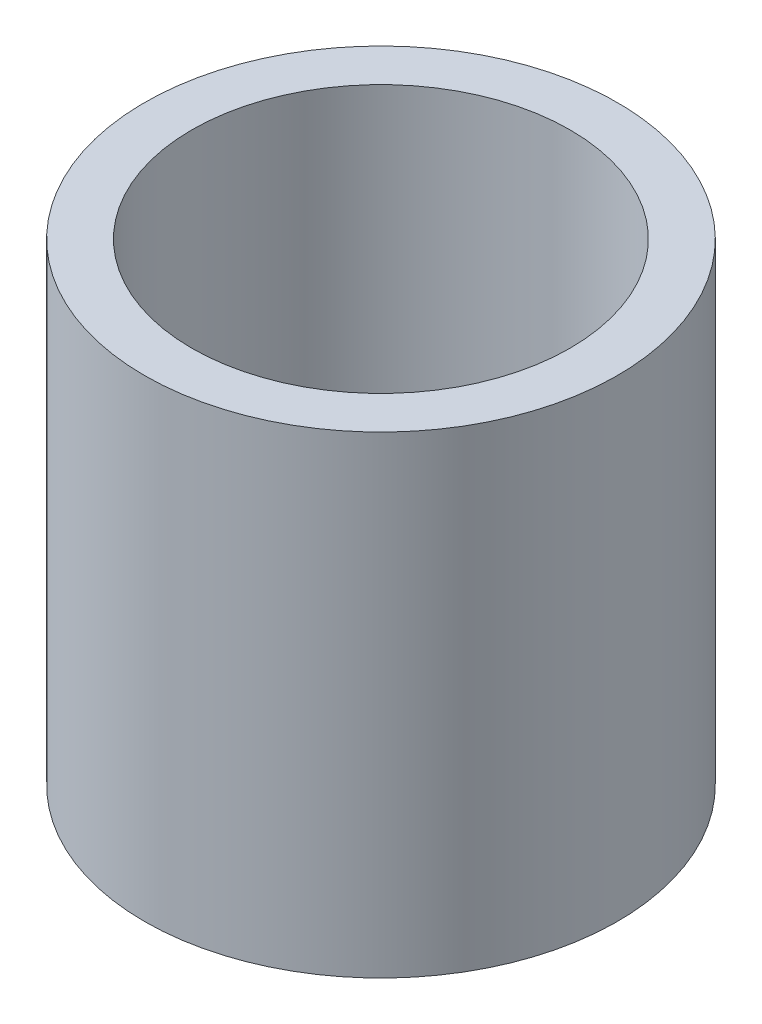
ISO-10303-21;
HEADER;
FILE_DESCRIPTION(('STEP AP214'),'2;1');
FILE_NAME('part.step','',(''),(''),'','','');
FILE_SCHEMA(('AUTOMOTIVE_DESIGN { 1 0 10303 214 1 1 1 1 }'));
ENDSEC;
DATA;
#1=APPLICATION_CONTEXT('core data for automotive mechanical design processes');
#2=APPLICATION_PROTOCOL_DEFINITION('international standard','automotive_design',2000,#1);
#3=PRODUCT_CONTEXT('',#1,'mechanical');
#4=PRODUCT('Part','Part','',(#3));
#5=PRODUCT_RELATED_PRODUCT_CATEGORY('part','',(#4));
#6=PRODUCT_DEFINITION_FORMATION('','',#4);
#7=PRODUCT_DEFINITION_CONTEXT('part definition',#1,'design');
#8=PRODUCT_DEFINITION('design','',#6,#7);
#9=PRODUCT_DEFINITION_SHAPE('','',#8);
#10=(LENGTH_UNIT() NAMED_UNIT(*) SI_UNIT(.MILLI.,.METRE.));
#11=(NAMED_UNIT(*) PLANE_ANGLE_UNIT() SI_UNIT($,.RADIAN.));
#12=(NAMED_UNIT(*) SI_UNIT($,.STERADIAN.) SOLID_ANGLE_UNIT());
#13=UNCERTAINTY_MEASURE_WITH_UNIT(LENGTH_MEASURE(1.E-05),#10,'distance_accuracy_value','');
#14=(GEOMETRIC_REPRESENTATION_CONTEXT(3) GLOBAL_UNCERTAINTY_ASSIGNED_CONTEXT((#13)) GLOBAL_UNIT_ASSIGNED_CONTEXT((#10,
#11,#12)) REPRESENTATION_CONTEXT('',''));
#15=CARTESIAN_POINT('',(0.,0.,0.));
#16=DIRECTION('',(0.,0.,1.));
#17=DIRECTION('',(1.,0.,0.));
#18=AXIS2_PLACEMENT_3D('',#15,#16,#17);
#19=CARTESIAN_POINT('',(0.,10.,0.));
#20=DIRECTION('',(0.,1.,0.));
#21=DIRECTION('',(0.,0.,1.));
#22=AXIS2_PLACEMENT_3D('',#19,#20,#21);
#23=PLANE('',#22);
#24=CARTESIAN_POINT('',(0.,10.,0.));
#25=DIRECTION('',(0.,1.,0.));
#26=DIRECTION('',(0.,0.,1.));
#27=AXIS2_PLACEMENT_3D('',#24,#25,#26);
#28=CIRCLE('',#27,5.);
#29=CARTESIAN_POINT('',(0.,10.,5.));
#30=VERTEX_POINT('',#29);
#31=EDGE_CURVE('E10',#30,#30,#28,.T.);
#32=ORIENTED_EDGE('',*,*,#31,.T.);
#33=EDGE_LOOP('',(#32));
#34=FACE_BOUND('',#33,.T.);
#35=CARTESIAN_POINT('',(0.,10.,0.));
#36=DIRECTION('',(0.,1.,0.));
#37=DIRECTION('',(0.,0.,1.));
#38=AXIS2_PLACEMENT_3D('',#35,#36,#37);
#39=CIRCLE('',#38,4.);
#40=CARTESIAN_POINT('',(0.,10.,4.));
#41=VERTEX_POINT('',#40);
#42=EDGE_CURVE('E50',#41,#41,#39,.T.);
#43=ORIENTED_EDGE('',*,*,#42,.F.);
#44=EDGE_LOOP('',(#43));
#45=FACE_BOUND('',#44,.T.);
#46=ADVANCED_FACE('F37',(#34,#45),#23,.T.);
#47=CARTESIAN_POINT('',(0.,0.,0.));
#48=DIRECTION('',(0.,1.,0.));
#49=DIRECTION('',(0.,0.,1.));
#50=AXIS2_PLACEMENT_3D('',#47,#48,#49);
#51=PLANE('',#50);
#52=CARTESIAN_POINT('',(0.,0.,0.));
#53=DIRECTION('',(0.,1.,0.));
#54=DIRECTION('',(0.,0.,1.));
#55=AXIS2_PLACEMENT_3D('',#52,#53,#54);
#56=CIRCLE('',#55,5.);
#57=CARTESIAN_POINT('',(0.,0.,5.));
#58=VERTEX_POINT('',#57);
#59=EDGE_CURVE('E41',#58,#58,#56,.T.);
#60=ORIENTED_EDGE('',*,*,#59,.F.);
#61=EDGE_LOOP('',(#60));
#62=FACE_BOUND('',#61,.T.);
#63=CARTESIAN_POINT('',(0.,0.,0.));
#64=DIRECTION('',(0.,1.,0.));
#65=DIRECTION('',(0.,0.,1.));
#66=AXIS2_PLACEMENT_3D('',#63,#64,#65);
#67=CIRCLE('',#66,4.);
#68=CARTESIAN_POINT('',(0.,0.,4.));
#69=VERTEX_POINT('',#68);
#70=EDGE_CURVE('E52',#69,#69,#67,.T.);
#71=ORIENTED_EDGE('',*,*,#70,.T.);
#72=EDGE_LOOP('',(#71));
#73=FACE_BOUND('',#72,.T.);
#74=ADVANCED_FACE('F64',(#62,#73),#51,.F.);
#75=CARTESIAN_POINT('',(0.,10.,0.));
#76=DIRECTION('',(0.,-1.,0.));
#77=DIRECTION('',(0.,0.,-1.));
#78=AXIS2_PLACEMENT_3D('',#75,#76,#77);
#79=CYLINDRICAL_SURFACE('',#78,5.);
#80=ORIENTED_EDGE('',*,*,#31,.F.);
#81=EDGE_LOOP('',(#80));
#82=FACE_BOUND('',#81,.T.);
#83=ORIENTED_EDGE('',*,*,#59,.T.);
#84=EDGE_LOOP('',(#83));
#85=FACE_BOUND('',#84,.T.);
#86=ADVANCED_FACE('F39',(#82,#85),#79,.T.);
#87=CARTESIAN_POINT('',(0.,10.,0.));
#88=DIRECTION('',(0.,-1.,0.));
#89=DIRECTION('',(0.,0.,-1.));
#90=AXIS2_PLACEMENT_3D('',#87,#88,#89);
#91=CYLINDRICAL_SURFACE('',#90,4.);
#92=ORIENTED_EDGE('',*,*,#42,.T.);
#93=EDGE_LOOP('',(#92));
#94=FACE_BOUND('',#93,.T.);
#95=ORIENTED_EDGE('',*,*,#70,.F.);
#96=EDGE_LOOP('',(#95));
#97=FACE_BOUND('',#96,.T.);
#98=ADVANCED_FACE('F60',(#94,#97),#91,.F.);
#99=CLOSED_SHELL('',(#46,#74,#86,#98));
#100=MANIFOLD_SOLID_BREP('B2',#99);
#101=ADVANCED_BREP_SHAPE_REPRESENTATION('',(#18,#100),#14);
#102=SHAPE_DEFINITION_REPRESENTATION(#9,#101);
ENDSEC;
END-ISO-10303-21;
